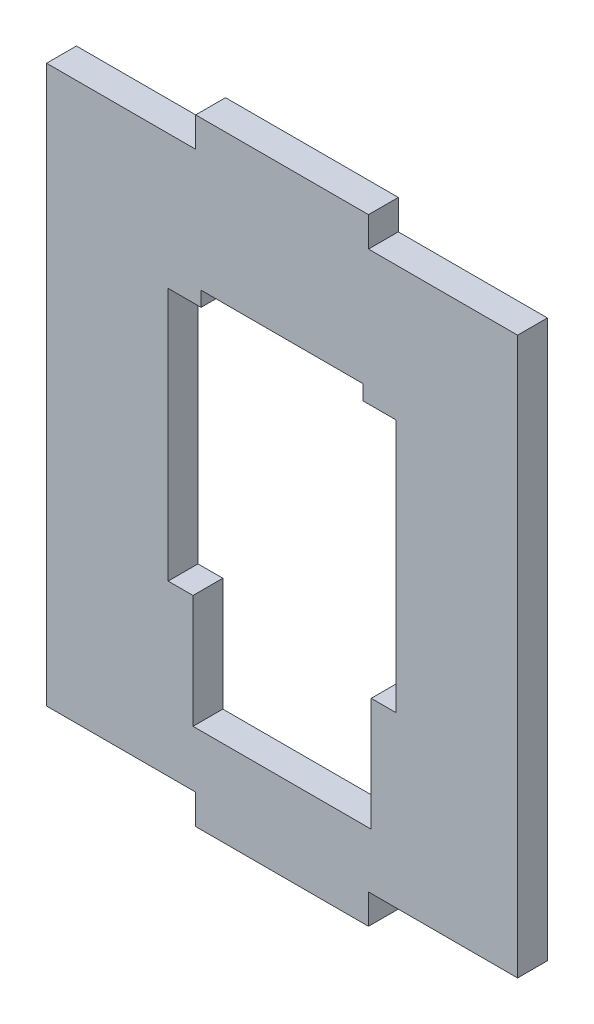
ISO-10303-21;
HEADER;
FILE_DESCRIPTION(('STEP AP214'),'2;1');
FILE_NAME('part.step','',(''),(''),'','','');
FILE_SCHEMA(('AUTOMOTIVE_DESIGN { 1 0 10303 214 1 1 1 1 }'));
ENDSEC;
DATA;
#1=APPLICATION_CONTEXT('core data for automotive mechanical design processes');
#2=APPLICATION_PROTOCOL_DEFINITION('international standard','automotive_design',2000,#1);
#3=PRODUCT_CONTEXT('',#1,'mechanical');
#4=PRODUCT('Part','Part','',(#3));
#5=PRODUCT_RELATED_PRODUCT_CATEGORY('part','',(#4));
#6=PRODUCT_DEFINITION_FORMATION('','',#4);
#7=PRODUCT_DEFINITION_CONTEXT('part definition',#1,'design');
#8=PRODUCT_DEFINITION('design','',#6,#7);
#9=PRODUCT_DEFINITION_SHAPE('','',#8);
#10=(LENGTH_UNIT() NAMED_UNIT(*) SI_UNIT(.MILLI.,.METRE.));
#11=(NAMED_UNIT(*) PLANE_ANGLE_UNIT() SI_UNIT($,.RADIAN.));
#12=(NAMED_UNIT(*) SI_UNIT($,.STERADIAN.) SOLID_ANGLE_UNIT());
#13=UNCERTAINTY_MEASURE_WITH_UNIT(LENGTH_MEASURE(1.E-05),#10,'distance_accuracy_value','');
#14=(GEOMETRIC_REPRESENTATION_CONTEXT(3) GLOBAL_UNCERTAINTY_ASSIGNED_CONTEXT((#13)) GLOBAL_UNIT_ASSIGNED_CONTEXT((#10,
#11,#12)) REPRESENTATION_CONTEXT('',''));
#15=CARTESIAN_POINT('',(0.,0.,0.));
#16=DIRECTION('',(0.,0.,1.));
#17=DIRECTION('',(1.,0.,0.));
#18=AXIS2_PLACEMENT_3D('',#15,#16,#17);
#19=CARTESIAN_POINT('',(0.,0.,3.));
#20=DIRECTION('',(0.,0.,-1.));
#21=DIRECTION('',(-1.,0.,0.));
#22=AXIS2_PLACEMENT_3D('',#19,#20,#21);
#23=PLANE('',#22);
#24=DIRECTION('',(0.,1.,0.));
#25=VECTOR('',#24,1.);
#26=CARTESIAN_POINT('',(32.38,59.,3.));
#27=LINE('',#26,#25);
#28=CARTESIAN_POINT('',(32.38,59.,3.));
#29=VERTEX_POINT('',#28);
#30=CARTESIAN_POINT('',(32.38,62.,3.));
#31=VERTEX_POINT('',#30);
#32=EDGE_CURVE('E287',#29,#31,#27,.T.);
#33=ORIENTED_EDGE('',*,*,#32,.T.);
#34=DIRECTION('',(-1.,0.,0.));
#35=VECTOR('',#34,1.);
#36=CARTESIAN_POINT('',(15.,62.,3.));
#37=LINE('',#36,#35);
#38=CARTESIAN_POINT('',(15.,62.,3.));
#39=VERTEX_POINT('',#38);
#40=EDGE_CURVE('E290',#31,#39,#37,.T.);
#41=ORIENTED_EDGE('',*,*,#40,.T.);
#42=DIRECTION('',(0.,-1.,0.));
#43=VECTOR('',#42,1.);
#44=CARTESIAN_POINT('',(15.,59.,3.));
#45=LINE('',#44,#43);
#46=CARTESIAN_POINT('',(15.,59.,3.));
#47=VERTEX_POINT('',#46);
#48=EDGE_CURVE('E293',#39,#47,#45,.T.);
#49=ORIENTED_EDGE('',*,*,#48,.T.);
#50=DIRECTION('',(-1.,0.,0.));
#51=VECTOR('',#50,1.);
#52=CARTESIAN_POINT('',(0.,59.,3.));
#53=LINE('',#52,#51);
#54=CARTESIAN_POINT('',(0.,59.,3.));
#55=VERTEX_POINT('',#54);
#56=EDGE_CURVE('E295',#47,#55,#53,.T.);
#57=ORIENTED_EDGE('',*,*,#56,.T.);
#58=DIRECTION('',(0.,-1.,0.));
#59=VECTOR('',#58,1.);
#60=CARTESIAN_POINT('',(0.,3.,3.));
#61=LINE('',#60,#59);
#62=CARTESIAN_POINT('',(0.,3.,3.));
#63=VERTEX_POINT('',#62);
#64=EDGE_CURVE('E297',#55,#63,#61,.T.);
#65=ORIENTED_EDGE('',*,*,#64,.T.);
#66=DIRECTION('',(1.,0.,0.));
#67=VECTOR('',#66,1.);
#68=CARTESIAN_POINT('',(0.,3.,3.));
#69=LINE('',#68,#67);
#70=CARTESIAN_POINT('',(15.,3.,3.));
#71=VERTEX_POINT('',#70);
#72=EDGE_CURVE('E299',#63,#71,#69,.T.);
#73=ORIENTED_EDGE('',*,*,#72,.T.);
#74=DIRECTION('',(0.,-1.,0.));
#75=VECTOR('',#74,1.);
#76=CARTESIAN_POINT('',(15.,3.,3.));
#77=LINE('',#76,#75);
#78=CARTESIAN_POINT('',(15.,0.,3.));
#79=VERTEX_POINT('',#78);
#80=EDGE_CURVE('E301',#71,#79,#77,.T.);
#81=ORIENTED_EDGE('',*,*,#80,.T.);
#82=DIRECTION('',(1.,0.,0.));
#83=VECTOR('',#82,1.);
#84=CARTESIAN_POINT('',(15.,0.,3.));
#85=LINE('',#84,#83);
#86=CARTESIAN_POINT('',(32.38,0.,3.));
#87=VERTEX_POINT('',#86);
#88=EDGE_CURVE('E303',#79,#87,#85,.T.);
#89=ORIENTED_EDGE('',*,*,#88,.T.);
#90=DIRECTION('',(0.,1.,0.));
#91=VECTOR('',#90,1.);
#92=CARTESIAN_POINT('',(32.38,3.,3.));
#93=LINE('',#92,#91);
#94=CARTESIAN_POINT('',(32.38,3.,3.));
#95=VERTEX_POINT('',#94);
#96=EDGE_CURVE('E305',#87,#95,#93,.T.);
#97=ORIENTED_EDGE('',*,*,#96,.T.);
#98=DIRECTION('',(1.,0.,0.));
#99=VECTOR('',#98,1.);
#100=CARTESIAN_POINT('',(32.38,3.,3.));
#101=LINE('',#100,#99);
#102=CARTESIAN_POINT('',(47.38,3.,3.));
#103=VERTEX_POINT('',#102);
#104=EDGE_CURVE('E307',#95,#103,#101,.T.);
#105=ORIENTED_EDGE('',*,*,#104,.T.);
#106=DIRECTION('',(0.,1.,0.));
#107=VECTOR('',#106,1.);
#108=CARTESIAN_POINT('',(47.38,3.,3.));
#109=LINE('',#108,#107);
#110=CARTESIAN_POINT('',(47.38,59.,3.));
#111=VERTEX_POINT('',#110);
#112=EDGE_CURVE('E309',#103,#111,#109,.T.);
#113=ORIENTED_EDGE('',*,*,#112,.T.);
#114=DIRECTION('',(-1.,0.,0.));
#115=VECTOR('',#114,1.);
#116=CARTESIAN_POINT('',(32.38,59.,3.));
#117=LINE('',#116,#115);
#118=EDGE_CURVE('E311',#111,#29,#117,.T.);
#119=ORIENTED_EDGE('',*,*,#118,.T.);
#120=EDGE_LOOP('',(#33,#41,#49,#57,#65,#73,#81,#89,#97,#105,#113,#119));
#121=FACE_BOUND('',#120,.T.);
#122=DIRECTION('',(1.,0.,0.));
#123=VECTOR('',#122,1.);
#124=CARTESIAN_POINT('',(12.2279674536983,20.,3.));
#125=LINE('',#124,#123);
#126=CARTESIAN_POINT('',(12.2279674536983,20.,3.));
#127=VERTEX_POINT('',#126);
#128=CARTESIAN_POINT('',(14.7279674536983,20.,3.));
#129=VERTEX_POINT('',#128);
#130=EDGE_CURVE('E198',#127,#129,#125,.T.);
#131=ORIENTED_EDGE('',*,*,#130,.F.);
#132=DIRECTION('',(0.,-1.,0.));
#133=VECTOR('',#132,1.);
#134=CARTESIAN_POINT('',(12.2279674536983,31.,3.));
#135=LINE('',#134,#133);
#136=CARTESIAN_POINT('',(12.2279674536983,45.5,3.));
#137=VERTEX_POINT('',#136);
#138=EDGE_CURVE('E193',#137,#127,#135,.T.);
#139=ORIENTED_EDGE('',*,*,#138,.F.);
#140=DIRECTION('',(-1.,0.,0.));
#141=VECTOR('',#140,1.);
#142=CARTESIAN_POINT('',(12.2279674536983,45.5,3.));
#143=LINE('',#142,#141);
#144=CARTESIAN_POINT('',(15.5399999985453,45.5,3.));
#145=VERTEX_POINT('',#144);
#146=EDGE_CURVE('E232',#145,#137,#143,.T.);
#147=ORIENTED_EDGE('',*,*,#146,.F.);
#148=DIRECTION('',(0.,-1.,0.));
#149=VECTOR('',#148,1.);
#150=CARTESIAN_POINT('',(15.5399999985453,45.5,3.));
#151=LINE('',#150,#149);
#152=CARTESIAN_POINT('',(15.5399999985453,47.,3.));
#153=VERTEX_POINT('',#152);
#154=EDGE_CURVE('E230',#153,#145,#151,.T.);
#155=ORIENTED_EDGE('',*,*,#154,.F.);
#156=DIRECTION('',(-1.,0.,0.));
#157=VECTOR('',#156,1.);
#158=CARTESIAN_POINT('',(15.5399999985453,47.,3.));
#159=LINE('',#158,#157);
#160=CARTESIAN_POINT('',(31.8399999986933,47.,3.));
#161=VERTEX_POINT('',#160);
#162=EDGE_CURVE('E228',#161,#153,#159,.T.);
#163=ORIENTED_EDGE('',*,*,#162,.F.);
#164=DIRECTION('',(0.,1.,0.));
#165=VECTOR('',#164,1.);
#166=CARTESIAN_POINT('',(31.8399999986933,47.,3.));
#167=LINE('',#166,#165);
#168=CARTESIAN_POINT('',(31.8399999986933,45.5,3.));
#169=VERTEX_POINT('',#168);
#170=EDGE_CURVE('E226',#169,#161,#167,.T.);
#171=ORIENTED_EDGE('',*,*,#170,.F.);
#172=DIRECTION('',(-1.,0.,0.));
#173=VECTOR('',#172,1.);
#174=CARTESIAN_POINT('',(31.8399999986933,45.5,3.));
#175=LINE('',#174,#173);
#176=CARTESIAN_POINT('',(35.1520324570506,45.5,3.));
#177=VERTEX_POINT('',#176);
#178=EDGE_CURVE('E224',#177,#169,#175,.T.);
#179=ORIENTED_EDGE('',*,*,#178,.F.);
#180=DIRECTION('',(0.,1.,0.));
#181=VECTOR('',#180,1.);
#182=CARTESIAN_POINT('',(35.1520324570506,20.,3.));
#183=LINE('',#182,#181);
#184=CARTESIAN_POINT('',(35.1520324570506,20.,3.));
#185=VERTEX_POINT('',#184);
#186=EDGE_CURVE('E222',#185,#177,#183,.T.);
#187=ORIENTED_EDGE('',*,*,#186,.F.);
#188=DIRECTION('',(1.,0.,0.));
#189=VECTOR('',#188,1.);
#190=CARTESIAN_POINT('',(35.1520324570506,20.,3.));
#191=LINE('',#190,#189);
#192=CARTESIAN_POINT('',(32.6520324570506,20.,3.));
#193=VERTEX_POINT('',#192);
#194=EDGE_CURVE('E220',#193,#185,#191,.T.);
#195=ORIENTED_EDGE('',*,*,#194,.F.);
#196=DIRECTION('',(0.,1.,0.));
#197=VECTOR('',#196,1.);
#198=CARTESIAN_POINT('',(32.6520324570506,20.,3.));
#199=LINE('',#198,#197);
#200=CARTESIAN_POINT('',(32.6520324570506,8.60000000000001,3.));
#201=VERTEX_POINT('',#200);
#202=EDGE_CURVE('E218',#201,#193,#199,.T.);
#203=ORIENTED_EDGE('',*,*,#202,.F.);
#204=DIRECTION('',(1.,0.,0.));
#205=VECTOR('',#204,1.);
#206=CARTESIAN_POINT('',(14.7279674536983,8.60000000000001,3.));
#207=LINE('',#206,#205);
#208=CARTESIAN_POINT('',(14.7279674536983,8.60000000000001,3.));
#209=VERTEX_POINT('',#208);
#210=EDGE_CURVE('E214',#209,#201,#207,.T.);
#211=ORIENTED_EDGE('',*,*,#210,.F.);
#212=DIRECTION('',(0.,-1.,0.));
#213=VECTOR('',#212,1.);
#214=CARTESIAN_POINT('',(14.7279674536983,20.,3.));
#215=LINE('',#214,#213);
#216=EDGE_CURVE('E212',#129,#209,#215,.T.);
#217=ORIENTED_EDGE('',*,*,#216,.F.);
#218=EDGE_LOOP('',(#131,#139,#147,#155,#163,#171,#179,#187,#195,#203,#211,#217));
#219=FACE_BOUND('',#218,.T.);
#220=ADVANCED_FACE('F35',(#121,#219),#23,.F.);
#221=CARTESIAN_POINT('',(0.,0.,0.));
#222=DIRECTION('',(0.,0.,-1.));
#223=DIRECTION('',(-1.,0.,0.));
#224=AXIS2_PLACEMENT_3D('',#221,#222,#223);
#225=PLANE('',#224);
#226=DIRECTION('',(0.,1.,0.));
#227=VECTOR('',#226,1.);
#228=CARTESIAN_POINT('',(32.38,59.,0.));
#229=LINE('',#228,#227);
#230=CARTESIAN_POINT('',(32.38,59.,0.));
#231=VERTEX_POINT('',#230);
#232=CARTESIAN_POINT('',(32.38,62.,0.));
#233=VERTEX_POINT('',#232);
#234=EDGE_CURVE('E207',#231,#233,#229,.T.);
#235=ORIENTED_EDGE('',*,*,#234,.F.);
#236=DIRECTION('',(-1.,0.,0.));
#237=VECTOR('',#236,1.);
#238=CARTESIAN_POINT('',(32.38,59.,0.));
#239=LINE('',#238,#237);
#240=CARTESIAN_POINT('',(47.38,59.,0.));
#241=VERTEX_POINT('',#240);
#242=EDGE_CURVE('E291',#241,#231,#239,.T.);
#243=ORIENTED_EDGE('',*,*,#242,.F.);
#244=DIRECTION('',(0.,1.,0.));
#245=VECTOR('',#244,1.);
#246=CARTESIAN_POINT('',(47.38,3.,0.));
#247=LINE('',#246,#245);
#248=CARTESIAN_POINT('',(47.38,3.,0.));
#249=VERTEX_POINT('',#248);
#250=EDGE_CURVE('E334',#249,#241,#247,.T.);
#251=ORIENTED_EDGE('',*,*,#250,.F.);
#252=DIRECTION('',(1.,0.,0.));
#253=VECTOR('',#252,1.);
#254=CARTESIAN_POINT('',(32.38,3.,0.));
#255=LINE('',#254,#253);
#256=CARTESIAN_POINT('',(32.38,3.,0.));
#257=VERTEX_POINT('',#256);
#258=EDGE_CURVE('E332',#257,#249,#255,.T.);
#259=ORIENTED_EDGE('',*,*,#258,.F.);
#260=DIRECTION('',(0.,1.,0.));
#261=VECTOR('',#260,1.);
#262=CARTESIAN_POINT('',(32.38,3.,0.));
#263=LINE('',#262,#261);
#264=CARTESIAN_POINT('',(32.38,0.,0.));
#265=VERTEX_POINT('',#264);
#266=EDGE_CURVE('E330',#265,#257,#263,.T.);
#267=ORIENTED_EDGE('',*,*,#266,.F.);
#268=DIRECTION('',(1.,0.,0.));
#269=VECTOR('',#268,1.);
#270=CARTESIAN_POINT('',(15.,0.,0.));
#271=LINE('',#270,#269);
#272=CARTESIAN_POINT('',(15.,0.,0.));
#273=VERTEX_POINT('',#272);
#274=EDGE_CURVE('E328',#273,#265,#271,.T.);
#275=ORIENTED_EDGE('',*,*,#274,.F.);
#276=DIRECTION('',(0.,-1.,0.));
#277=VECTOR('',#276,1.);
#278=CARTESIAN_POINT('',(15.,3.,0.));
#279=LINE('',#278,#277);
#280=CARTESIAN_POINT('',(15.,3.,0.));
#281=VERTEX_POINT('',#280);
#282=EDGE_CURVE('E326',#281,#273,#279,.T.);
#283=ORIENTED_EDGE('',*,*,#282,.F.);
#284=DIRECTION('',(1.,0.,0.));
#285=VECTOR('',#284,1.);
#286=CARTESIAN_POINT('',(0.,3.,0.));
#287=LINE('',#286,#285);
#288=CARTESIAN_POINT('',(0.,3.,0.));
#289=VERTEX_POINT('',#288);
#290=EDGE_CURVE('E324',#289,#281,#287,.T.);
#291=ORIENTED_EDGE('',*,*,#290,.F.);
#292=DIRECTION('',(0.,-1.,0.));
#293=VECTOR('',#292,1.);
#294=CARTESIAN_POINT('',(0.,3.,0.));
#295=LINE('',#294,#293);
#296=CARTESIAN_POINT('',(0.,59.,0.));
#297=VERTEX_POINT('',#296);
#298=EDGE_CURVE('E322',#297,#289,#295,.T.);
#299=ORIENTED_EDGE('',*,*,#298,.F.);
#300=DIRECTION('',(-1.,0.,0.));
#301=VECTOR('',#300,1.);
#302=CARTESIAN_POINT('',(0.,59.,0.));
#303=LINE('',#302,#301);
#304=CARTESIAN_POINT('',(15.,59.,0.));
#305=VERTEX_POINT('',#304);
#306=EDGE_CURVE('E320',#305,#297,#303,.T.);
#307=ORIENTED_EDGE('',*,*,#306,.F.);
#308=DIRECTION('',(0.,-1.,0.));
#309=VECTOR('',#308,1.);
#310=CARTESIAN_POINT('',(15.,59.,0.));
#311=LINE('',#310,#309);
#312=CARTESIAN_POINT('',(15.,62.,0.));
#313=VERTEX_POINT('',#312);
#314=EDGE_CURVE('E318',#313,#305,#311,.T.);
#315=ORIENTED_EDGE('',*,*,#314,.F.);
#316=DIRECTION('',(-1.,0.,0.));
#317=VECTOR('',#316,1.);
#318=CARTESIAN_POINT('',(15.,62.,0.));
#319=LINE('',#318,#317);
#320=EDGE_CURVE('E316',#233,#313,#319,.T.);
#321=ORIENTED_EDGE('',*,*,#320,.F.);
#322=EDGE_LOOP('',(#235,#243,#251,#259,#267,#275,#283,#291,#299,#307,#315,#321));
#323=FACE_BOUND('',#322,.T.);
#324=DIRECTION('',(0.,-1.,0.));
#325=VECTOR('',#324,1.);
#326=CARTESIAN_POINT('',(12.2279674536983,31.,0.));
#327=LINE('',#326,#325);
#328=CARTESIAN_POINT('',(12.2279674536983,45.5,0.));
#329=VERTEX_POINT('',#328);
#330=CARTESIAN_POINT('',(12.2279674536983,20.,0.));
#331=VERTEX_POINT('',#330);
#332=EDGE_CURVE('E199',#329,#331,#327,.T.);
#333=ORIENTED_EDGE('',*,*,#332,.T.);
#334=DIRECTION('',(1.,0.,0.));
#335=VECTOR('',#334,1.);
#336=CARTESIAN_POINT('',(12.2279674536983,20.,0.));
#337=LINE('',#336,#335);
#338=CARTESIAN_POINT('',(14.7279674536983,20.,0.));
#339=VERTEX_POINT('',#338);
#340=EDGE_CURVE('E205',#331,#339,#337,.T.);
#341=ORIENTED_EDGE('',*,*,#340,.T.);
#342=DIRECTION('',(0.,-1.,0.));
#343=VECTOR('',#342,1.);
#344=CARTESIAN_POINT('',(14.7279674536983,20.,0.));
#345=LINE('',#344,#343);
#346=CARTESIAN_POINT('',(14.7279674536983,8.60000000000001,0.));
#347=VERTEX_POINT('',#346);
#348=EDGE_CURVE('E235',#339,#347,#345,.T.);
#349=ORIENTED_EDGE('',*,*,#348,.T.);
#350=DIRECTION('',(1.,0.,0.));
#351=VECTOR('',#350,1.);
#352=CARTESIAN_POINT('',(14.7279674536983,8.60000000000001,0.));
#353=LINE('',#352,#351);
#354=CARTESIAN_POINT('',(32.6520324570506,8.60000000000001,0.));
#355=VERTEX_POINT('',#354);
#356=EDGE_CURVE('E238',#347,#355,#353,.T.);
#357=ORIENTED_EDGE('',*,*,#356,.T.);
#358=DIRECTION('',(0.,1.,0.));
#359=VECTOR('',#358,1.);
#360=CARTESIAN_POINT('',(32.6520324570506,20.,0.));
#361=LINE('',#360,#359);
#362=CARTESIAN_POINT('',(32.6520324570506,20.,0.));
#363=VERTEX_POINT('',#362);
#364=EDGE_CURVE('E241',#355,#363,#361,.T.);
#365=ORIENTED_EDGE('',*,*,#364,.T.);
#366=DIRECTION('',(1.,0.,0.));
#367=VECTOR('',#366,1.);
#368=CARTESIAN_POINT('',(35.1520324570506,20.,0.));
#369=LINE('',#368,#367);
#370=CARTESIAN_POINT('',(35.1520324570506,20.,0.));
#371=VERTEX_POINT('',#370);
#372=EDGE_CURVE('E244',#363,#371,#369,.T.);
#373=ORIENTED_EDGE('',*,*,#372,.T.);
#374=DIRECTION('',(0.,1.,0.));
#375=VECTOR('',#374,1.);
#376=CARTESIAN_POINT('',(35.1520324570506,45.5,0.));
#377=LINE('',#376,#375);
#378=CARTESIAN_POINT('',(35.1520324570506,45.5,0.));
#379=VERTEX_POINT('',#378);
#380=EDGE_CURVE('E247',#371,#379,#377,.T.);
#381=ORIENTED_EDGE('',*,*,#380,.T.);
#382=DIRECTION('',(-1.,0.,0.));
#383=VECTOR('',#382,1.);
#384=CARTESIAN_POINT('',(31.8399999986933,45.5,0.));
#385=LINE('',#384,#383);
#386=CARTESIAN_POINT('',(31.8399999986933,45.5,0.));
#387=VERTEX_POINT('',#386);
#388=EDGE_CURVE('E250',#379,#387,#385,.T.);
#389=ORIENTED_EDGE('',*,*,#388,.T.);
#390=DIRECTION('',(0.,1.,0.));
#391=VECTOR('',#390,1.);
#392=CARTESIAN_POINT('',(31.8399999986933,47.,0.));
#393=LINE('',#392,#391);
#394=CARTESIAN_POINT('',(31.8399999986933,47.,0.));
#395=VERTEX_POINT('',#394);
#396=EDGE_CURVE('E253',#387,#395,#393,.T.);
#397=ORIENTED_EDGE('',*,*,#396,.T.);
#398=DIRECTION('',(-1.,0.,0.));
#399=VECTOR('',#398,1.);
#400=CARTESIAN_POINT('',(15.5399999985453,47.,0.));
#401=LINE('',#400,#399);
#402=CARTESIAN_POINT('',(15.5399999985453,47.,0.));
#403=VERTEX_POINT('',#402);
#404=EDGE_CURVE('E256',#395,#403,#401,.T.);
#405=ORIENTED_EDGE('',*,*,#404,.T.);
#406=DIRECTION('',(0.,-1.,0.));
#407=VECTOR('',#406,1.);
#408=CARTESIAN_POINT('',(15.5399999985453,45.5,0.));
#409=LINE('',#408,#407);
#410=CARTESIAN_POINT('',(15.5399999985453,45.5,0.));
#411=VERTEX_POINT('',#410);
#412=EDGE_CURVE('E259',#403,#411,#409,.T.);
#413=ORIENTED_EDGE('',*,*,#412,.T.);
#414=DIRECTION('',(-1.,0.,0.));
#415=VECTOR('',#414,1.);
#416=CARTESIAN_POINT('',(12.2279674536983,45.5,0.));
#417=LINE('',#416,#415);
#418=EDGE_CURVE('E262',#411,#329,#417,.T.);
#419=ORIENTED_EDGE('',*,*,#418,.T.);
#420=EDGE_LOOP('',(#333,#341,#349,#357,#365,#373,#381,#389,#397,#405,#413,#419));
#421=FACE_BOUND('',#420,.T.);
#422=ADVANCED_FACE('F376',(#323,#421),#225,.T.);
#423=CARTESIAN_POINT('',(32.38,59.,3.));
#424=DIRECTION('',(-1.,0.,0.));
#425=DIRECTION('',(0.,0.,1.));
#426=AXIS2_PLACEMENT_3D('',#423,#424,#425);
#427=PLANE('',#426);
#428=ORIENTED_EDGE('',*,*,#234,.T.);
#429=DIRECTION('',(0.,0.,-1.));
#430=VECTOR('',#429,1.);
#431=CARTESIAN_POINT('',(32.38,62.,3.));
#432=LINE('',#431,#430);
#433=EDGE_CURVE('E11',#31,#233,#432,.T.);
#434=ORIENTED_EDGE('',*,*,#433,.F.);
#435=ORIENTED_EDGE('',*,*,#32,.F.);
#436=DIRECTION('',(0.,0.,-1.));
#437=VECTOR('',#436,1.);
#438=CARTESIAN_POINT('',(32.38,59.,3.));
#439=LINE('',#438,#437);
#440=EDGE_CURVE('E313',#29,#231,#439,.T.);
#441=ORIENTED_EDGE('',*,*,#440,.T.);
#442=EDGE_LOOP('',(#428,#434,#435,#441));
#443=FACE_BOUND('',#442,.T.);
#444=ADVANCED_FACE('F37',(#443),#427,.F.);
#445=CARTESIAN_POINT('',(15.,62.,3.));
#446=DIRECTION('',(0.,-1.,0.));
#447=DIRECTION('',(0.,0.,-1.));
#448=AXIS2_PLACEMENT_3D('',#445,#446,#447);
#449=PLANE('',#448);
#450=ORIENTED_EDGE('',*,*,#320,.T.);
#451=DIRECTION('',(0.,0.,-1.));
#452=VECTOR('',#451,1.);
#453=CARTESIAN_POINT('',(15.,62.,3.));
#454=LINE('',#453,#452);
#455=EDGE_CURVE('E43',#39,#313,#454,.T.);
#456=ORIENTED_EDGE('',*,*,#455,.F.);
#457=ORIENTED_EDGE('',*,*,#40,.F.);
#458=ORIENTED_EDGE('',*,*,#433,.T.);
#459=EDGE_LOOP('',(#450,#456,#457,#458));
#460=FACE_BOUND('',#459,.T.);
#461=ADVANCED_FACE('F393',(#460),#449,.F.);
#462=CARTESIAN_POINT('',(15.,59.,3.));
#463=DIRECTION('',(1.,0.,0.));
#464=DIRECTION('',(0.,0.,-1.));
#465=AXIS2_PLACEMENT_3D('',#462,#463,#464);
#466=PLANE('',#465);
#467=ORIENTED_EDGE('',*,*,#314,.T.);
#468=DIRECTION('',(0.,0.,-1.));
#469=VECTOR('',#468,1.);
#470=CARTESIAN_POINT('',(15.,59.,3.));
#471=LINE('',#470,#469);
#472=EDGE_CURVE('E363',#47,#305,#471,.T.);
#473=ORIENTED_EDGE('',*,*,#472,.F.);
#474=ORIENTED_EDGE('',*,*,#48,.F.);
#475=ORIENTED_EDGE('',*,*,#455,.T.);
#476=EDGE_LOOP('',(#467,#473,#474,#475));
#477=FACE_BOUND('',#476,.T.);
#478=ADVANCED_FACE('F370',(#477),#466,.F.);
#479=CARTESIAN_POINT('',(0.,59.,3.));
#480=DIRECTION('',(0.,-1.,0.));
#481=DIRECTION('',(1.,0.,0.));
#482=AXIS2_PLACEMENT_3D('',#479,#480,#481);
#483=PLANE('',#482);
#484=ORIENTED_EDGE('',*,*,#306,.T.);
#485=DIRECTION('',(0.,0.,-1.));
#486=VECTOR('',#485,1.);
#487=CARTESIAN_POINT('',(0.,59.,3.));
#488=LINE('',#487,#486);
#489=EDGE_CURVE('E360',#55,#297,#488,.T.);
#490=ORIENTED_EDGE('',*,*,#489,.F.);
#491=ORIENTED_EDGE('',*,*,#56,.F.);
#492=ORIENTED_EDGE('',*,*,#472,.T.);
#493=EDGE_LOOP('',(#484,#490,#491,#492));
#494=FACE_BOUND('',#493,.T.);
#495=ADVANCED_FACE('F382',(#494),#483,.F.);
#496=CARTESIAN_POINT('',(0.,3.,3.));
#497=DIRECTION('',(1.,0.,0.));
#498=DIRECTION('',(0.,1.,0.));
#499=AXIS2_PLACEMENT_3D('',#496,#497,#498);
#500=PLANE('',#499);
#501=ORIENTED_EDGE('',*,*,#298,.T.);
#502=DIRECTION('',(0.,0.,-1.));
#503=VECTOR('',#502,1.);
#504=CARTESIAN_POINT('',(0.,3.,3.));
#505=LINE('',#504,#503);
#506=EDGE_CURVE('E357',#63,#289,#505,.T.);
#507=ORIENTED_EDGE('',*,*,#506,.F.);
#508=ORIENTED_EDGE('',*,*,#64,.F.);
#509=ORIENTED_EDGE('',*,*,#489,.T.);
#510=EDGE_LOOP('',(#501,#507,#508,#509));
#511=FACE_BOUND('',#510,.T.);
#512=ADVANCED_FACE('F386',(#511),#500,.F.);
#513=CARTESIAN_POINT('',(0.,3.,3.));
#514=DIRECTION('',(0.,1.,0.));
#515=DIRECTION('',(0.,0.,1.));
#516=AXIS2_PLACEMENT_3D('',#513,#514,#515);
#517=PLANE('',#516);
#518=ORIENTED_EDGE('',*,*,#290,.T.);
#519=DIRECTION('',(0.,0.,-1.));
#520=VECTOR('',#519,1.);
#521=CARTESIAN_POINT('',(15.,3.,3.));
#522=LINE('',#521,#520);
#523=EDGE_CURVE('E354',#71,#281,#522,.T.);
#524=ORIENTED_EDGE('',*,*,#523,.F.);
#525=ORIENTED_EDGE('',*,*,#72,.F.);
#526=ORIENTED_EDGE('',*,*,#506,.T.);
#527=EDGE_LOOP('',(#518,#524,#525,#526));
#528=FACE_BOUND('',#527,.T.);
#529=ADVANCED_FACE('F426',(#528),#517,.F.);
#530=CARTESIAN_POINT('',(15.,3.,3.));
#531=DIRECTION('',(1.,0.,0.));
#532=DIRECTION('',(0.,0.,-1.));
#533=AXIS2_PLACEMENT_3D('',#530,#531,#532);
#534=PLANE('',#533);
#535=ORIENTED_EDGE('',*,*,#282,.T.);
#536=DIRECTION('',(0.,0.,-1.));
#537=VECTOR('',#536,1.);
#538=CARTESIAN_POINT('',(15.,0.,3.));
#539=LINE('',#538,#537);
#540=EDGE_CURVE('E351',#79,#273,#539,.T.);
#541=ORIENTED_EDGE('',*,*,#540,.F.);
#542=ORIENTED_EDGE('',*,*,#80,.F.);
#543=ORIENTED_EDGE('',*,*,#523,.T.);
#544=EDGE_LOOP('',(#535,#541,#542,#543));
#545=FACE_BOUND('',#544,.T.);
#546=ADVANCED_FACE('F424',(#545),#534,.F.);
#547=CARTESIAN_POINT('',(15.,0.,3.));
#548=DIRECTION('',(0.,1.,0.));
#549=DIRECTION('',(0.,0.,1.));
#550=AXIS2_PLACEMENT_3D('',#547,#548,#549);
#551=PLANE('',#550);
#552=ORIENTED_EDGE('',*,*,#274,.T.);
#553=DIRECTION('',(0.,0.,-1.));
#554=VECTOR('',#553,1.);
#555=CARTESIAN_POINT('',(32.38,0.,3.));
#556=LINE('',#555,#554);
#557=EDGE_CURVE('E348',#87,#265,#556,.T.);
#558=ORIENTED_EDGE('',*,*,#557,.F.);
#559=ORIENTED_EDGE('',*,*,#88,.F.);
#560=ORIENTED_EDGE('',*,*,#540,.T.);
#561=EDGE_LOOP('',(#552,#558,#559,#560));
#562=FACE_BOUND('',#561,.T.);
#563=ADVANCED_FACE('F420',(#562),#551,.F.);
#564=CARTESIAN_POINT('',(32.38,3.,3.));
#565=DIRECTION('',(-1.,0.,0.));
#566=DIRECTION('',(0.,0.,1.));
#567=AXIS2_PLACEMENT_3D('',#564,#565,#566);
#568=PLANE('',#567);
#569=ORIENTED_EDGE('',*,*,#266,.T.);
#570=DIRECTION('',(0.,0.,-1.));
#571=VECTOR('',#570,1.);
#572=CARTESIAN_POINT('',(32.38,3.,3.));
#573=LINE('',#572,#571);
#574=EDGE_CURVE('E345',#95,#257,#573,.T.);
#575=ORIENTED_EDGE('',*,*,#574,.F.);
#576=ORIENTED_EDGE('',*,*,#96,.F.);
#577=ORIENTED_EDGE('',*,*,#557,.T.);
#578=EDGE_LOOP('',(#569,#575,#576,#577));
#579=FACE_BOUND('',#578,.T.);
#580=ADVANCED_FACE('F415',(#579),#568,.F.);
#581=CARTESIAN_POINT('',(32.38,3.,3.));
#582=DIRECTION('',(0.,1.,0.));
#583=DIRECTION('',(0.,0.,1.));
#584=AXIS2_PLACEMENT_3D('',#581,#582,#583);
#585=PLANE('',#584);
#586=ORIENTED_EDGE('',*,*,#258,.T.);
#587=DIRECTION('',(0.,0.,-1.));
#588=VECTOR('',#587,1.);
#589=CARTESIAN_POINT('',(47.38,3.,3.));
#590=LINE('',#589,#588);
#591=EDGE_CURVE('E342',#103,#249,#590,.T.);
#592=ORIENTED_EDGE('',*,*,#591,.F.);
#593=ORIENTED_EDGE('',*,*,#104,.F.);
#594=ORIENTED_EDGE('',*,*,#574,.T.);
#595=EDGE_LOOP('',(#586,#592,#593,#594));
#596=FACE_BOUND('',#595,.T.);
#597=ADVANCED_FACE('F409',(#596),#585,.F.);
#598=CARTESIAN_POINT('',(47.38,3.,3.));
#599=DIRECTION('',(-1.,0.,0.));
#600=DIRECTION('',(0.,-1.,0.));
#601=AXIS2_PLACEMENT_3D('',#598,#599,#600);
#602=PLANE('',#601);
#603=ORIENTED_EDGE('',*,*,#250,.T.);
#604=DIRECTION('',(0.,0.,-1.));
#605=VECTOR('',#604,1.);
#606=CARTESIAN_POINT('',(47.38,59.,3.));
#607=LINE('',#606,#605);
#608=EDGE_CURVE('E339',#111,#241,#607,.T.);
#609=ORIENTED_EDGE('',*,*,#608,.F.);
#610=ORIENTED_EDGE('',*,*,#112,.F.);
#611=ORIENTED_EDGE('',*,*,#591,.T.);
#612=EDGE_LOOP('',(#603,#609,#610,#611));
#613=FACE_BOUND('',#612,.T.);
#614=ADVANCED_FACE('F405',(#613),#602,.F.);
#615=CARTESIAN_POINT('',(32.38,59.,3.));
#616=DIRECTION('',(0.,-1.,0.));
#617=DIRECTION('',(1.,0.,0.));
#618=AXIS2_PLACEMENT_3D('',#615,#616,#617);
#619=PLANE('',#618);
#620=ORIENTED_EDGE('',*,*,#242,.T.);
#621=ORIENTED_EDGE('',*,*,#440,.F.);
#622=ORIENTED_EDGE('',*,*,#118,.F.);
#623=ORIENTED_EDGE('',*,*,#608,.T.);
#624=EDGE_LOOP('',(#620,#621,#622,#623));
#625=FACE_BOUND('',#624,.T.);
#626=ADVANCED_FACE('F400',(#625),#619,.F.);
#627=CARTESIAN_POINT('',(12.2279674536983,20.,3.));
#628=DIRECTION('',(0.,1.,0.));
#629=DIRECTION('',(0.,0.,1.));
#630=AXIS2_PLACEMENT_3D('',#627,#628,#629);
#631=PLANE('',#630);
#632=ORIENTED_EDGE('',*,*,#340,.F.);
#633=DIRECTION('',(0.,0.,-1.));
#634=VECTOR('',#633,1.);
#635=CARTESIAN_POINT('',(12.2279674536983,20.,3.));
#636=LINE('',#635,#634);
#637=EDGE_CURVE('E55',#127,#331,#636,.T.);
#638=ORIENTED_EDGE('',*,*,#637,.F.);
#639=ORIENTED_EDGE('',*,*,#130,.T.);
#640=DIRECTION('',(0.,0.,-1.));
#641=VECTOR('',#640,1.);
#642=CARTESIAN_POINT('',(14.7279674536983,20.,3.));
#643=LINE('',#642,#641);
#644=EDGE_CURVE('E208',#129,#339,#643,.T.);
#645=ORIENTED_EDGE('',*,*,#644,.T.);
#646=EDGE_LOOP('',(#632,#638,#639,#645));
#647=FACE_BOUND('',#646,.T.);
#648=ADVANCED_FACE('F202',(#647),#631,.T.);
#649=CARTESIAN_POINT('',(14.7279674536983,20.,3.));
#650=DIRECTION('',(1.,0.,0.));
#651=DIRECTION('',(0.,0.,-1.));
#652=AXIS2_PLACEMENT_3D('',#649,#650,#651);
#653=PLANE('',#652);
#654=ORIENTED_EDGE('',*,*,#348,.F.);
#655=ORIENTED_EDGE('',*,*,#644,.F.);
#656=ORIENTED_EDGE('',*,*,#216,.T.);
#657=DIRECTION('',(0.,0.,-1.));
#658=VECTOR('',#657,1.);
#659=CARTESIAN_POINT('',(14.7279674536983,8.60000000000001,3.));
#660=LINE('',#659,#658);
#661=EDGE_CURVE('E284',#209,#347,#660,.T.);
#662=ORIENTED_EDGE('',*,*,#661,.T.);
#663=EDGE_LOOP('',(#654,#655,#656,#662));
#664=FACE_BOUND('',#663,.T.);
#665=ADVANCED_FACE('F479',(#664),#653,.T.);
#666=CARTESIAN_POINT('',(14.7279674536983,8.60000000000001,3.));
#667=DIRECTION('',(0.,1.,0.));
#668=DIRECTION('',(0.,0.,1.));
#669=AXIS2_PLACEMENT_3D('',#666,#667,#668);
#670=PLANE('',#669);
#671=ORIENTED_EDGE('',*,*,#356,.F.);
#672=ORIENTED_EDGE('',*,*,#661,.F.);
#673=ORIENTED_EDGE('',*,*,#210,.T.);
#674=DIRECTION('',(0.,0.,-1.));
#675=VECTOR('',#674,1.);
#676=CARTESIAN_POINT('',(32.6520324570506,8.60000000000001,3.));
#677=LINE('',#676,#675);
#678=EDGE_CURVE('E282',#201,#355,#677,.T.);
#679=ORIENTED_EDGE('',*,*,#678,.T.);
#680=EDGE_LOOP('',(#671,#672,#673,#679));
#681=FACE_BOUND('',#680,.T.);
#682=ADVANCED_FACE('F485',(#681),#670,.T.);
#683=CARTESIAN_POINT('',(32.6520324570506,20.,3.));
#684=DIRECTION('',(-1.,0.,0.));
#685=DIRECTION('',(0.,0.,1.));
#686=AXIS2_PLACEMENT_3D('',#683,#684,#685);
#687=PLANE('',#686);
#688=ORIENTED_EDGE('',*,*,#364,.F.);
#689=ORIENTED_EDGE('',*,*,#678,.F.);
#690=ORIENTED_EDGE('',*,*,#202,.T.);
#691=DIRECTION('',(0.,0.,-1.));
#692=VECTOR('',#691,1.);
#693=CARTESIAN_POINT('',(32.6520324570506,20.,3.));
#694=LINE('',#693,#692);
#695=EDGE_CURVE('E280',#193,#363,#694,.T.);
#696=ORIENTED_EDGE('',*,*,#695,.T.);
#697=EDGE_LOOP('',(#688,#689,#690,#696));
#698=FACE_BOUND('',#697,.T.);
#699=ADVANCED_FACE('F492',(#698),#687,.T.);
#700=CARTESIAN_POINT('',(35.1520324570506,20.,3.));
#701=DIRECTION('',(0.,1.,0.));
#702=DIRECTION('',(0.,0.,1.));
#703=AXIS2_PLACEMENT_3D('',#700,#701,#702);
#704=PLANE('',#703);
#705=ORIENTED_EDGE('',*,*,#372,.F.);
#706=ORIENTED_EDGE('',*,*,#695,.F.);
#707=ORIENTED_EDGE('',*,*,#194,.T.);
#708=DIRECTION('',(0.,0.,-1.));
#709=VECTOR('',#708,1.);
#710=CARTESIAN_POINT('',(35.1520324570506,20.,3.));
#711=LINE('',#710,#709);
#712=EDGE_CURVE('E277',#185,#371,#711,.T.);
#713=ORIENTED_EDGE('',*,*,#712,.T.);
#714=EDGE_LOOP('',(#705,#706,#707,#713));
#715=FACE_BOUND('',#714,.T.);
#716=ADVANCED_FACE('F500',(#715),#704,.T.);
#717=CARTESIAN_POINT('',(35.1520324570506,45.5,3.));
#718=DIRECTION('',(-1.,0.,0.));
#719=DIRECTION('',(0.,0.,1.));
#720=AXIS2_PLACEMENT_3D('',#717,#718,#719);
#721=PLANE('',#720);
#722=ORIENTED_EDGE('',*,*,#380,.F.);
#723=ORIENTED_EDGE('',*,*,#712,.F.);
#724=ORIENTED_EDGE('',*,*,#186,.T.);
#725=DIRECTION('',(0.,0.,-1.));
#726=VECTOR('',#725,1.);
#727=CARTESIAN_POINT('',(35.1520324570506,45.5,3.));
#728=LINE('',#727,#726);
#729=EDGE_CURVE('E275',#177,#379,#728,.T.);
#730=ORIENTED_EDGE('',*,*,#729,.T.);
#731=EDGE_LOOP('',(#722,#723,#724,#730));
#732=FACE_BOUND('',#731,.T.);
#733=ADVANCED_FACE('F508',(#732),#721,.T.);
#734=CARTESIAN_POINT('',(31.8399999986933,45.5,3.));
#735=DIRECTION('',(0.,-1.,0.));
#736=DIRECTION('',(0.,0.,-1.));
#737=AXIS2_PLACEMENT_3D('',#734,#735,#736);
#738=PLANE('',#737);
#739=ORIENTED_EDGE('',*,*,#388,.F.);
#740=ORIENTED_EDGE('',*,*,#729,.F.);
#741=ORIENTED_EDGE('',*,*,#178,.T.);
#742=DIRECTION('',(0.,0.,-1.));
#743=VECTOR('',#742,1.);
#744=CARTESIAN_POINT('',(31.8399999986933,45.5,3.));
#745=LINE('',#744,#743);
#746=EDGE_CURVE('E273',#169,#387,#745,.T.);
#747=ORIENTED_EDGE('',*,*,#746,.T.);
#748=EDGE_LOOP('',(#739,#740,#741,#747));
#749=FACE_BOUND('',#748,.T.);
#750=ADVANCED_FACE('F516',(#749),#738,.T.);
#751=CARTESIAN_POINT('',(31.8399999986933,47.,3.));
#752=DIRECTION('',(-1.,0.,0.));
#753=DIRECTION('',(0.,0.,1.));
#754=AXIS2_PLACEMENT_3D('',#751,#752,#753);
#755=PLANE('',#754);
#756=ORIENTED_EDGE('',*,*,#396,.F.);
#757=ORIENTED_EDGE('',*,*,#746,.F.);
#758=ORIENTED_EDGE('',*,*,#170,.T.);
#759=DIRECTION('',(0.,0.,-1.));
#760=VECTOR('',#759,1.);
#761=CARTESIAN_POINT('',(31.8399999986933,47.,3.));
#762=LINE('',#761,#760);
#763=EDGE_CURVE('E271',#161,#395,#762,.T.);
#764=ORIENTED_EDGE('',*,*,#763,.T.);
#765=EDGE_LOOP('',(#756,#757,#758,#764));
#766=FACE_BOUND('',#765,.T.);
#767=ADVANCED_FACE('F524',(#766),#755,.T.);
#768=CARTESIAN_POINT('',(15.5399999985453,47.,3.));
#769=DIRECTION('',(0.,-1.,0.));
#770=DIRECTION('',(0.,0.,-1.));
#771=AXIS2_PLACEMENT_3D('',#768,#769,#770);
#772=PLANE('',#771);
#773=ORIENTED_EDGE('',*,*,#404,.F.);
#774=ORIENTED_EDGE('',*,*,#763,.F.);
#775=ORIENTED_EDGE('',*,*,#162,.T.);
#776=DIRECTION('',(0.,0.,-1.));
#777=VECTOR('',#776,1.);
#778=CARTESIAN_POINT('',(15.5399999985453,47.,3.));
#779=LINE('',#778,#777);
#780=EDGE_CURVE('E269',#153,#403,#779,.T.);
#781=ORIENTED_EDGE('',*,*,#780,.T.);
#782=EDGE_LOOP('',(#773,#774,#775,#781));
#783=FACE_BOUND('',#782,.T.);
#784=ADVANCED_FACE('F532',(#783),#772,.T.);
#785=CARTESIAN_POINT('',(15.5399999985453,45.5,3.));
#786=DIRECTION('',(1.,0.,0.));
#787=DIRECTION('',(0.,0.,-1.));
#788=AXIS2_PLACEMENT_3D('',#785,#786,#787);
#789=PLANE('',#788);
#790=ORIENTED_EDGE('',*,*,#412,.F.);
#791=ORIENTED_EDGE('',*,*,#780,.F.);
#792=ORIENTED_EDGE('',*,*,#154,.T.);
#793=DIRECTION('',(0.,0.,-1.));
#794=VECTOR('',#793,1.);
#795=CARTESIAN_POINT('',(15.5399999985453,45.5,3.));
#796=LINE('',#795,#794);
#797=EDGE_CURVE('E267',#145,#411,#796,.T.);
#798=ORIENTED_EDGE('',*,*,#797,.T.);
#799=EDGE_LOOP('',(#790,#791,#792,#798));
#800=FACE_BOUND('',#799,.T.);
#801=ADVANCED_FACE('F540',(#800),#789,.T.);
#802=CARTESIAN_POINT('',(12.2279674536983,45.5,3.));
#803=DIRECTION('',(0.,-1.,0.));
#804=DIRECTION('',(0.,0.,-1.));
#805=AXIS2_PLACEMENT_3D('',#802,#803,#804);
#806=PLANE('',#805);
#807=ORIENTED_EDGE('',*,*,#418,.F.);
#808=ORIENTED_EDGE('',*,*,#797,.F.);
#809=ORIENTED_EDGE('',*,*,#146,.T.);
#810=DIRECTION('',(0.,0.,-1.));
#811=VECTOR('',#810,1.);
#812=CARTESIAN_POINT('',(12.2279674536983,45.5,3.));
#813=LINE('',#812,#811);
#814=EDGE_CURVE('E50',#137,#329,#813,.T.);
#815=ORIENTED_EDGE('',*,*,#814,.T.);
#816=EDGE_LOOP('',(#807,#808,#809,#815));
#817=FACE_BOUND('',#816,.T.);
#818=ADVANCED_FACE('F548',(#817),#806,.T.);
#819=CARTESIAN_POINT('',(12.2279674536983,31.,3.));
#820=DIRECTION('',(1.,0.,0.));
#821=DIRECTION('',(0.,0.,-1.));
#822=AXIS2_PLACEMENT_3D('',#819,#820,#821);
#823=PLANE('',#822);
#824=ORIENTED_EDGE('',*,*,#332,.F.);
#825=ORIENTED_EDGE('',*,*,#814,.F.);
#826=ORIENTED_EDGE('',*,*,#138,.T.);
#827=ORIENTED_EDGE('',*,*,#637,.T.);
#828=EDGE_LOOP('',(#824,#825,#826,#827));
#829=FACE_BOUND('',#828,.T.);
#830=ADVANCED_FACE('F194',(#829),#823,.T.);
#831=CLOSED_SHELL('',(#220,#422,#444,#461,#478,#495,#512,#529,#546,#563,#580,#597,#614,#626,
#648,#665,#682,#699,#716,#733,#750,#767,#784,#801,#818,#830));
#832=MANIFOLD_SOLID_BREP('B2',#831);
#833=ADVANCED_BREP_SHAPE_REPRESENTATION('',(#18,#832),#14);
#834=SHAPE_DEFINITION_REPRESENTATION(#9,#833);
ENDSEC;
END-ISO-10303-21;
